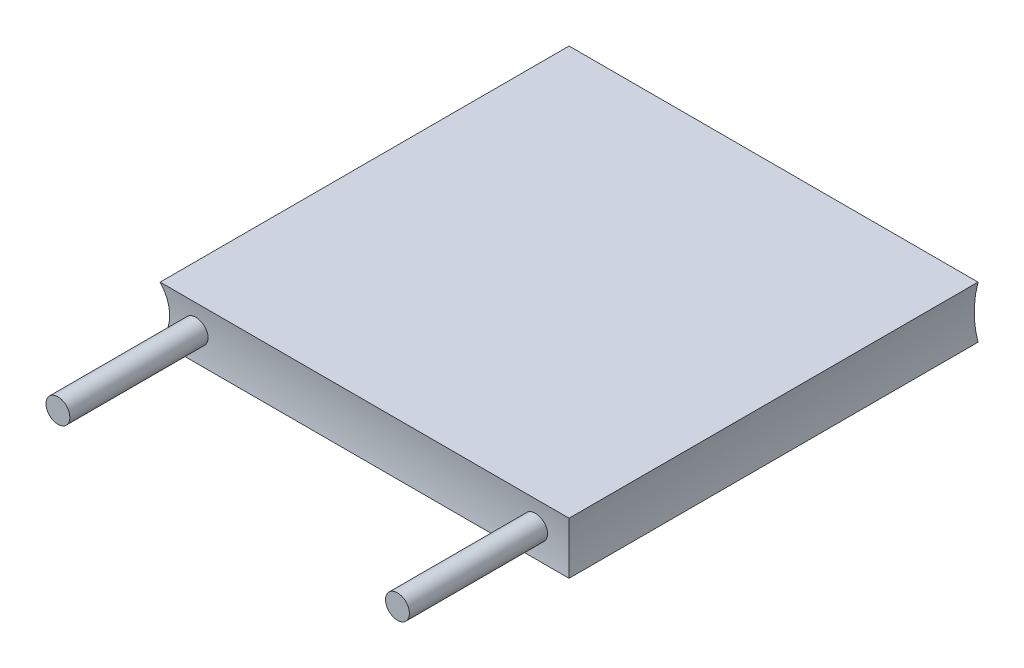
ISO-10303-21;
HEADER;
FILE_DESCRIPTION(('STEP AP214'),'2;1');
FILE_NAME('part.step','',(''),(''),'','','');
FILE_SCHEMA(('AUTOMOTIVE_DESIGN { 1 0 10303 214 1 1 1 1 }'));
ENDSEC;
DATA;
#1=APPLICATION_CONTEXT('core data for automotive mechanical design processes');
#2=APPLICATION_PROTOCOL_DEFINITION('international standard','automotive_design',2000,#1);
#3=PRODUCT_CONTEXT('',#1,'mechanical');
#4=PRODUCT('Part','Part','',(#3));
#5=PRODUCT_RELATED_PRODUCT_CATEGORY('part','',(#4));
#6=PRODUCT_DEFINITION_FORMATION('','',#4);
#7=PRODUCT_DEFINITION_CONTEXT('part definition',#1,'design');
#8=PRODUCT_DEFINITION('design','',#6,#7);
#9=PRODUCT_DEFINITION_SHAPE('','',#8);
#10=(LENGTH_UNIT() NAMED_UNIT(*) SI_UNIT(.MILLI.,.METRE.));
#11=(NAMED_UNIT(*) PLANE_ANGLE_UNIT() SI_UNIT($,.RADIAN.));
#12=(NAMED_UNIT(*) SI_UNIT($,.STERADIAN.) SOLID_ANGLE_UNIT());
#13=UNCERTAINTY_MEASURE_WITH_UNIT(LENGTH_MEASURE(1.E-05),#10,'distance_accuracy_value','');
#14=(GEOMETRIC_REPRESENTATION_CONTEXT(3) GLOBAL_UNCERTAINTY_ASSIGNED_CONTEXT((#13)) GLOBAL_UNIT_ASSIGNED_CONTEXT((#10,
#11,#12)) REPRESENTATION_CONTEXT('',''));
#15=CARTESIAN_POINT('',(0.,0.,0.));
#16=DIRECTION('',(0.,0.,1.));
#17=DIRECTION('',(1.,0.,0.));
#18=AXIS2_PLACEMENT_3D('',#15,#16,#17);
#19=CARTESIAN_POINT('',(43.,1.91,-30.));
#20=DIRECTION('',(0.,0.,1.));
#21=DIRECTION('',(1.,0.,0.));
#22=AXIS2_PLACEMENT_3D('',#19,#20,#21);
#23=CYLINDRICAL_SURFACE('',#22,13.1395623975839);
#24=CARTESIAN_POINT('',(43.,1.91,-43.));
#25=DIRECTION('',(0.707106781186547,0.,0.707106781186548));
#26=DIRECTION('',(-0.707106781186547,0.,0.707106781186548));
#27=AXIS2_PLACEMENT_3D('',#24,#25,#26);
#28=ELLIPSE('',#27,18.5821473463107,13.1395623975839);
#29=CARTESIAN_POINT('',(30.,3.82,-30.));
#30=VERTEX_POINT('',#29);
#31=CARTESIAN_POINT('',(30.,0.,-30.));
#32=VERTEX_POINT('',#31);
#33=EDGE_CURVE('E101',#30,#32,#28,.T.);
#34=ORIENTED_EDGE('',*,*,#33,.F.);
#35=DIRECTION('',(0.,0.,-1.));
#36=VECTOR('',#35,1.);
#37=CARTESIAN_POINT('',(30.,3.82,0.));
#38=LINE('',#37,#36);
#39=CARTESIAN_POINT('',(30.,3.82,0.));
#40=VERTEX_POINT('',#39);
#41=EDGE_CURVE('E92',#40,#30,#38,.T.);
#42=ORIENTED_EDGE('',*,*,#41,.F.);
#43=CARTESIAN_POINT('',(43.,1.91,13.));
#44=DIRECTION('',(-0.707106781186547,0.,0.707106781186548));
#45=DIRECTION('',(0.707106781186547,0.,0.707106781186548));
#46=AXIS2_PLACEMENT_3D('',#43,#44,#45);
#47=ELLIPSE('',#46,18.5821473463106,13.1395623975839);
#48=CARTESIAN_POINT('',(30.,0.,0.));
#49=VERTEX_POINT('',#48);
#50=EDGE_CURVE('E131',#40,#49,#47,.T.);
#51=ORIENTED_EDGE('',*,*,#50,.T.);
#52=DIRECTION('',(0.,0.,-1.));
#53=VECTOR('',#52,1.);
#54=CARTESIAN_POINT('',(30.,0.,0.));
#55=LINE('',#54,#53);
#56=EDGE_CURVE('E103',#49,#32,#55,.T.);
#57=ORIENTED_EDGE('',*,*,#56,.T.);
#58=EDGE_LOOP('',(#34,#42,#51,#57));
#59=FACE_BOUND('',#58,.T.);
#60=ADVANCED_FACE('F32',(#59),#23,.F.);
#61=CARTESIAN_POINT('',(-3.,1.91,-30.));
#62=DIRECTION('',(0.,0.,1.));
#63=DIRECTION('',(1.,0.,0.));
#64=AXIS2_PLACEMENT_3D('',#61,#62,#63);
#65=CYLINDRICAL_SURFACE('',#64,3.55641673598582);
#66=DIRECTION('',(0.,0.,1.));
#67=VECTOR('',#66,1.);
#68=CARTESIAN_POINT('',(0.,3.82,0.));
#69=LINE('',#68,#67);
#70=CARTESIAN_POINT('',(0.,3.82,-30.));
#71=VERTEX_POINT('',#70);
#72=CARTESIAN_POINT('',(0.,3.82,0.));
#73=VERTEX_POINT('',#72);
#74=EDGE_CURVE('E85',#71,#73,#69,.T.);
#75=ORIENTED_EDGE('',*,*,#74,.F.);
#76=CARTESIAN_POINT('',(0.,3.82,-30.));
#77=CARTESIAN_POINT('',(0.0524340141665732,3.7376576027691,-29.9878959296317));
#78=CARTESIAN_POINT('',(0.101497308266513,3.65309589850319,-29.9762770147328));
#79=CARTESIAN_POINT('',(0.192565787085412,3.48008531427569,-29.9542920316486));
#80=CARTESIAN_POINT('',(0.234570111388854,3.39163596210516,-29.9439261162342));
#81=CARTESIAN_POINT('',(0.311192698175684,3.21141797930009,-29.9247323422504));
#82=CARTESIAN_POINT('',(0.34581064305102,3.11964920613159,-29.9159045498219));
#83=CARTESIAN_POINT('',(0.407382960768319,2.93345987035824,-29.900023500811));
#84=CARTESIAN_POINT('',(0.434337815801482,2.83903947501468,-29.8929701325782));
#85=CARTESIAN_POINT('',(0.503402555288943,2.55249978066082,-29.8747663273823));
#86=CARTESIAN_POINT('',(0.533681682249221,2.35717473757787,-29.8665801791533));
#87=CARTESIAN_POINT('',(0.561457987623733,1.96421636047236,-29.859078593547));
#88=CARTESIAN_POINT('',(0.558970390129337,1.76658414105347,-29.8597590365681));
#89=CARTESIAN_POINT('',(0.521725621723675,1.37802347432962,-29.8697964380615));
#90=CARTESIAN_POINT('',(0.487517113333934,1.18703817837664,-29.8790058709809));
#91=CARTESIAN_POINT('',(0.38871370456758,0.813662563870923,-29.9049198565123));
#92=CARTESIAN_POINT('',(0.324135148656792,0.631267680171523,-29.9216203773687));
#93=CARTESIAN_POINT('',(0.2100829254487,0.376703919434626,-29.9499623690591));
#94=CARTESIAN_POINT('',(0.171828525401818,0.299072168959661,-29.9593363274005));
#95=CARTESIAN_POINT('',(0.0899185885653121,0.147069033577241,-29.9790160477099));
#96=CARTESIAN_POINT('',(0.0462757461150745,0.072690524409943,-29.9893196048162));
#97=CARTESIAN_POINT('',(0.,0.,-30.));
#98=B_SPLINE_CURVE_WITH_KNOTS('',3,(#76,#77,#78,#79,#80,#81,#82,#83,#84,#85,#86,#87,#88,#89,#90,
#91,#92,#93,#94,#95,#96,#97),.UNSPECIFIED.,.F.,.F.,(4,2,2,2,2,2,2,2,2,2,4),(0.,
0.295019032244304,0.59007399822107,0.885141648755497,1.18019072838255,1.7705242492091,
2.36058349866819,2.94062339726882,3.52035148825475,3.78131265540512,4.04167036673184),.UNSPECIFIED.);
#99=CARTESIAN_POINT('',(0.,0.,-30.));
#100=VERTEX_POINT('',#99);
#101=EDGE_CURVE('E11',#71,#100,#98,.T.);
#102=ORIENTED_EDGE('',*,*,#101,.T.);
#103=DIRECTION('',(0.,0.,1.));
#104=VECTOR('',#103,1.);
#105=CARTESIAN_POINT('',(0.,0.,0.));
#106=LINE('',#105,#104);
#107=CARTESIAN_POINT('',(0.,0.,0.));
#108=VERTEX_POINT('',#107);
#109=EDGE_CURVE('E98',#100,#108,#106,.T.);
#110=ORIENTED_EDGE('',*,*,#109,.T.);
#111=CARTESIAN_POINT('',(0.,3.82,0.));
#112=CARTESIAN_POINT('',(0.0524340141665755,3.7376576027691,-0.012104070368281));
#113=CARTESIAN_POINT('',(0.101497308266515,3.65309589850318,-0.0237229852672433));
#114=CARTESIAN_POINT('',(0.192565787085414,3.48008531427568,-0.0457079683514324));
#115=CARTESIAN_POINT('',(0.234570111388855,3.39163596210516,-0.0560738837657963));
#116=CARTESIAN_POINT('',(0.311192698175684,3.21141797930008,-0.07526765774962));
#117=CARTESIAN_POINT('',(0.345810643051021,3.11964920613159,-0.0840954501781037));
#118=CARTESIAN_POINT('',(0.40738296076832,2.93345987035824,-0.0999764991889885));
#119=CARTESIAN_POINT('',(0.434337815801483,2.83903947501468,-0.107029867421795));
#120=CARTESIAN_POINT('',(0.503402555288944,2.55249978066081,-0.125233672617654));
#121=CARTESIAN_POINT('',(0.533681682249222,2.35717473757786,-0.133419820846655));
#122=CARTESIAN_POINT('',(0.561457987623734,1.96421636047235,-0.140921406453019));
#123=CARTESIAN_POINT('',(0.558970390129337,1.76658414105347,-0.140240963431877));
#124=CARTESIAN_POINT('',(0.521725621723675,1.37802347432962,-0.130203561938456));
#125=CARTESIAN_POINT('',(0.487517113333933,1.18703817837664,-0.120994129019062));
#126=CARTESIAN_POINT('',(0.388713704567579,0.813662563870919,-0.0950801434877438));
#127=CARTESIAN_POINT('',(0.32413514865679,0.63126768017152,-0.0783796226313037));
#128=CARTESIAN_POINT('',(0.210082925448698,0.376703919434623,-0.0500376309409025));
#129=CARTESIAN_POINT('',(0.171828525401817,0.299072168959659,-0.0406636725994515));
#130=CARTESIAN_POINT('',(0.0899185885653115,0.14706903357724,-0.0209839522901296));
#131=CARTESIAN_POINT('',(0.0462757461150744,0.0726905244099426,-0.010680395183792));
#132=CARTESIAN_POINT('',(0.,0.,0.));
#133=B_SPLINE_CURVE_WITH_KNOTS('',3,(#111,#112,#113,#114,#115,#116,#117,#118,#119,#120,#121,
#122,#123,#124,#125,#126,#127,#128,#129,#130,#131,#132),.UNSPECIFIED.,.F.,.F.,(4,2,2,2,2,2,2,2,
2,2,4),(0.,0.295019032244303,0.590073998221069,0.885141648755496,1.18019072838255,
1.7705242492091,2.36058349866819,2.94062339726882,3.52035148825475,3.78131265540511,
4.04167036673183),.UNSPECIFIED.);
#134=EDGE_CURVE('E46',#73,#108,#133,.T.);
#135=ORIENTED_EDGE('',*,*,#134,.F.);
#136=EDGE_LOOP('',(#75,#102,#110,#135));
#137=FACE_BOUND('',#136,.T.);
#138=ADVANCED_FACE('F86',(#137),#65,.F.);
#139=CARTESIAN_POINT('',(0.,3.82,0.));
#140=DIRECTION('',(0.,-1.,0.));
#141=DIRECTION('',(0.,0.,-1.));
#142=AXIS2_PLACEMENT_3D('',#139,#140,#141);
#143=PLANE('',#142);
#144=ORIENTED_EDGE('',*,*,#74,.T.);
#145=DIRECTION('',(1.,0.,0.));
#146=VECTOR('',#145,1.);
#147=CARTESIAN_POINT('',(0.,3.82,0.));
#148=LINE('',#147,#146);
#149=EDGE_CURVE('E61',#73,#40,#148,.T.);
#150=ORIENTED_EDGE('',*,*,#149,.T.);
#151=ORIENTED_EDGE('',*,*,#41,.T.);
#152=DIRECTION('',(-1.,0.,0.));
#153=VECTOR('',#152,1.);
#154=CARTESIAN_POINT('',(0.,3.82,-30.));
#155=LINE('',#154,#153);
#156=EDGE_CURVE('E79',#30,#71,#155,.T.);
#157=ORIENTED_EDGE('',*,*,#156,.T.);
#158=EDGE_LOOP('',(#144,#150,#151,#157));
#159=FACE_BOUND('',#158,.T.);
#160=ADVANCED_FACE('F90',(#159),#143,.F.);
#161=CARTESIAN_POINT('',(0.,0.,0.));
#162=DIRECTION('',(0.,-1.,0.));
#163=DIRECTION('',(0.,0.,-1.));
#164=AXIS2_PLACEMENT_3D('',#161,#162,#163);
#165=PLANE('',#164);
#166=ORIENTED_EDGE('',*,*,#109,.F.);
#167=DIRECTION('',(-1.,0.,0.));
#168=VECTOR('',#167,1.);
#169=CARTESIAN_POINT('',(0.,0.,-30.));
#170=LINE('',#169,#168);
#171=EDGE_CURVE('E54',#32,#100,#170,.T.);
#172=ORIENTED_EDGE('',*,*,#171,.F.);
#173=ORIENTED_EDGE('',*,*,#56,.F.);
#174=DIRECTION('',(1.,0.,0.));
#175=VECTOR('',#174,1.);
#176=CARTESIAN_POINT('',(0.,0.,0.));
#177=LINE('',#176,#175);
#178=EDGE_CURVE('E100',#108,#49,#177,.T.);
#179=ORIENTED_EDGE('',*,*,#178,.F.);
#180=EDGE_LOOP('',(#166,#172,#173,#179));
#181=FACE_BOUND('',#180,.T.);
#182=ADVANCED_FACE('F34',(#181),#165,.T.);
#183=CARTESIAN_POINT('',(45.,1.91,13.));
#184=DIRECTION('',(-1.,0.,0.));
#185=DIRECTION('',(0.,0.,1.));
#186=AXIS2_PLACEMENT_3D('',#183,#184,#185);
#187=CYLINDRICAL_SURFACE('',#186,13.1395623975838);
#188=CARTESIAN_POINT('',(28.2856665159736,1.91,-0.13956239758387));
#189=CARTESIAN_POINT('',(28.2856643585644,1.86090922868925,-0.139562011231252));
#190=CARTESIAN_POINT('',(28.2815213674995,1.81178425006474,-0.139284344695328));
#191=CARTESIAN_POINT('',(28.2650538879974,1.71489122104358,-0.138203372676909));
#192=CARTESIAN_POINT('',(28.2527199210849,1.6671248096187,-0.137399458243601));
#193=CARTESIAN_POINT('',(28.2202267431594,1.57436640791405,-0.1353569176843));
#194=CARTESIAN_POINT('',(28.2000717123431,1.52937295040941,-0.134118523812416));
#195=CARTESIAN_POINT('',(28.1525154376539,1.44341938562474,-0.131346238360727));
#196=CARTESIAN_POINT('',(28.1251158341772,1.40245836815288,-0.129812413696948));
#197=CARTESIAN_POINT('',(28.0637979033463,1.32565197687493,-0.126618741211458));
#198=CARTESIAN_POINT('',(28.0298699618723,1.28981428543958,-0.124958709736525));
#199=CARTESIAN_POINT('',(27.9564783880142,1.2243375959128,-0.121701281471802));
#200=CARTESIAN_POINT('',(27.9170145224303,1.1946988590824,-0.120103887324228));
#201=CARTESIAN_POINT('',(27.8336270941972,1.14243716995884,-0.117150436424197));
#202=CARTESIAN_POINT('',(27.7896994668654,1.11982068947904,-0.115794602784876));
#203=CARTESIAN_POINT('',(27.6986599217259,1.08228690385613,-0.113479580144612));
#204=CARTESIAN_POINT('',(27.6515480419754,1.06736950671439,-0.112520386404128));
#205=CARTESIAN_POINT('',(27.5555520871962,1.04567889697692,-0.111108581462636));
#206=CARTESIAN_POINT('',(27.5066707702489,1.03889352796965,-0.110655214181674));
#207=CARTESIAN_POINT('',(27.4084610315657,1.03362205413911,-0.110303925663096));
#208=CARTESIAN_POINT('',(27.359132615479,1.03513584459974,-0.110405997417129));
#209=CARTESIAN_POINT('',(27.2615118460389,1.04640963954711,-0.111153374572183));
#210=CARTESIAN_POINT('',(27.213217964821,1.0561564796105,-0.111797812738008));
#211=CARTESIAN_POINT('',(27.118953268784,1.08359927176277,-0.113555936418823));
#212=CARTESIAN_POINT('',(27.0729824694206,1.10129527673063,-0.114669625055331));
#213=CARTESIAN_POINT('',(26.9846266443685,1.14414898325375,-0.117241746748748));
#214=CARTESIAN_POINT('',(26.942244517869,1.16931264517466,-0.118700454996112));
#215=CARTESIAN_POINT('',(26.8623008083921,1.22638304690261,-0.121797963300711));
#216=CARTESIAN_POINT('',(26.8247392871868,1.25828987310381,-0.123436765665201));
#217=CARTESIAN_POINT('',(26.7554264377825,1.32801497610843,-0.126713639011839));
#218=CARTESIAN_POINT('',(26.7236865666891,1.36584464376005,-0.128351702354884));
#219=CARTESIAN_POINT('',(26.6670064062316,1.4463016855573,-0.131439442657029));
#220=CARTESIAN_POINT('',(26.6420661195564,1.48892906160007,-0.132889119541634));
#221=CARTESIAN_POINT('',(26.5996940162001,1.57777852132476,-0.135436874592644));
#222=CARTESIAN_POINT('',(26.5822626462441,1.62400081868489,-0.136534931839279));
#223=CARTESIAN_POINT('',(26.5554109062885,1.71872488137971,-0.138255443022908));
#224=CARTESIAN_POINT('',(26.5459904301021,1.76722661649078,-0.138877903264075));
#225=CARTESIAN_POINT('',(26.5354421162315,1.86503337989685,-0.139576269345161));
#226=CARTESIAN_POINT('',(26.534298440704,1.91433669297839,-0.139653219025976));
#227=CARTESIAN_POINT('',(26.5402947923253,2.01243444018222,-0.139254671621502));
#228=CARTESIAN_POINT('',(26.5474347704467,2.06122887731462,-0.138779177805894));
#229=CARTESIAN_POINT('',(26.5697826355352,2.15687906685138,-0.137329934164601));
#230=CARTESIAN_POINT('',(26.584983243081,2.20373652741603,-0.136356633927777));
#231=CARTESIAN_POINT('',(26.623013477166,2.29423540810253,-0.134021247922862));
#232=CARTESIAN_POINT('',(26.6458431814993,2.33787679542448,-0.132659158190298));
#233=CARTESIAN_POINT('',(26.6985237851387,2.42077715968067,-0.129696577050649));
#234=CARTESIAN_POINT('',(26.7283852473351,2.46002941126629,-0.128095728326673));
#235=CARTESIAN_POINT('',(26.7942663548604,2.532969541853,-0.124836935617119));
#236=CARTESIAN_POINT('',(26.8302860688146,2.56665735883792,-0.123178990995452));
#237=CARTESIAN_POINT('',(26.9075296124453,2.62756611520377,-0.119989831664507));
#238=CARTESIAN_POINT('',(26.9487615620632,2.65477676914425,-0.118458820999653));
#239=CARTESIAN_POINT('',(27.0352184123286,2.7018884048618,-0.115699449197823));
#240=CARTESIAN_POINT('',(27.0804432856587,2.72178943664229,-0.114471085990524));
#241=CARTESIAN_POINT('',(27.1735648471413,2.75369914999014,-0.112457013516544));
#242=CARTESIAN_POINT('',(27.2214593194708,2.76571427423339,-0.111670942978083));
#243=CARTESIAN_POINT('',(27.3185912334587,2.78153213754436,-0.110629105588364));
#244=CARTESIAN_POINT('',(27.3678286596281,2.78533497128831,-0.110373332623519));
#245=CARTESIAN_POINT('',(27.4661465557826,2.78461936645529,-0.110421083568697));
#246=CARTESIAN_POINT('',(27.5152271447912,2.78011709590752,-0.110723520779187));
#247=CARTESIAN_POINT('',(27.6119337534358,2.76295264040811,-0.111851308691024));
#248=CARTESIAN_POINT('',(27.6595597704968,2.75029044101225,-0.112676660318003));
#249=CARTESIAN_POINT('',(27.7520074782674,2.71716929121108,-0.114757000464673));
#250=CARTESIAN_POINT('',(27.7968292086758,2.69671045120775,-0.116011982900682));
#251=CARTESIAN_POINT('',(27.8824038349883,2.64857888852322,-0.118810151700708));
#252=CARTESIAN_POINT('',(27.9231568289826,2.62090633980997,-0.120353331114225));
#253=CARTESIAN_POINT('',(27.9995193609765,2.55907279853523,-0.12355751953105));
#254=CARTESIAN_POINT('',(28.0351193619501,2.5249000392475,-0.125218738740693));
#255=CARTESIAN_POINT('',(28.1000902290545,2.45105341462624,-0.128469985152853));
#256=CARTESIAN_POINT('',(28.1294595720447,2.41137820808088,-0.130059994872797));
#257=CARTESIAN_POINT('',(28.1811600828675,2.32760240202661,-0.132991515532781));
#258=CARTESIAN_POINT('',(28.2034817405894,2.2834959278202,-0.134332689698195));
#259=CARTESIAN_POINT('',(28.2403751976539,2.19218401156649,-0.136611028367243));
#260=CARTESIAN_POINT('',(28.2549560442571,2.1449822600496,-0.137548664272136));
#261=CARTESIAN_POINT('',(28.2721775124933,2.06624456381904,-0.138669433308048));
#262=CARTESIAN_POINT('',(28.2772293164366,2.03521715382826,-0.139002800447328));
#263=CARTESIAN_POINT('',(28.2839745056085,1.97279782899003,-0.139449405995041));
#264=CARTESIAN_POINT('',(28.2856678961803,1.94140591472258,-0.139562644753695));
#265=CARTESIAN_POINT('',(28.2856665159736,1.91,-0.13956239758387));
#266=B_SPLINE_CURVE_WITH_KNOTS('',3,(#188,#189,#190,#191,#192,#193,#194,#195,#196,#197,#198,
#199,#200,#201,#202,#203,#204,#205,#206,#207,#208,#209,#210,#211,#212,#213,#214,#215,#216,#217,
#218,#219,#220,#221,#222,#223,#224,#225,#226,#227,#228,#229,#230,#231,#232,#233,#234,#235,#236,
#237,#238,#239,#240,#241,#242,#243,#244,#245,#246,#247,#248,#249,#250,#251,#252,#253,#254,#255,
#256,#257,#258,#259,#260,#261,#262,#263,#264,#265),.UNSPECIFIED.,.T.,.F.,(4,2,2,2,2,2,2,2,2,2,2,
2,2,2,2,2,2,2,2,2,2,2,2,2,2,2,2,2,2,2,2,2,2,2,2,2,2,2,4),(0.,0.147157661025031,0.29448590812443,
0.441735519544378,0.588951817591815,0.736386600054847,0.883827595050107,1.03140407321466,
1.17897878790324,1.32633261973306,1.47368459230393,1.62080139809449,1.76791918254134,
1.9151547074054,2.06239211878158,2.20991625753702,2.35744045462749,2.50497342710632,
2.6525044439602,2.79975308208555,2.94700084871216,3.09411586420951,3.24123237988684,
3.38857131532298,3.53591189275533,3.68348490238464,3.83105690248264,3.97850818775215,
4.12595777310574,4.27312061267051,4.42028371273491,4.567444729018,4.71460219665041,
4.86202862945173,5.00949106055114,5.15715163458887,5.30463924467709,5.39878378921106,
5.49292818396237),.UNSPECIFIED.);
#267=CARTESIAN_POINT('',(28.2856665159736,1.91,-0.13956239758387));
#268=VERTEX_POINT('',#267);
#269=EDGE_CURVE('E36',#268,#268,#266,.T.);
#270=ORIENTED_EDGE('',*,*,#269,.T.);
#271=EDGE_LOOP('',(#270));
#272=FACE_BOUND('',#271,.T.);
#273=CARTESIAN_POINT('',(3.375,1.91,-0.13956239758387));
#274=CARTESIAN_POINT('',(3.3749978425908,1.86090922868925,-0.139562011231252));
#275=CARTESIAN_POINT('',(3.37085485152586,1.81178425006473,-0.139284344695328));
#276=CARTESIAN_POINT('',(3.35438737202379,1.71489122104358,-0.138203372676909));
#277=CARTESIAN_POINT('',(3.34205340511129,1.6671248096187,-0.137399458243601));
#278=CARTESIAN_POINT('',(3.30956022718576,1.57436640791405,-0.1353569176843));
#279=CARTESIAN_POINT('',(3.28940519636949,1.5293729504094,-0.134118523812416));
#280=CARTESIAN_POINT('',(3.24184892168029,1.44341938562474,-0.131346238360727));
#281=CARTESIAN_POINT('',(3.21444931820352,1.40245836815288,-0.129812413696948));
#282=CARTESIAN_POINT('',(3.15313138737268,1.32565197687492,-0.126618741211458));
#283=CARTESIAN_POINT('',(3.11920344589862,1.28981428543958,-0.124958709736525));
#284=CARTESIAN_POINT('',(3.04581187204058,1.2243375959128,-0.121701281471802));
#285=CARTESIAN_POINT('',(3.00634800645671,1.1946988590824,-0.120103887324228));
#286=CARTESIAN_POINT('',(2.92296057822355,1.14243716995884,-0.117150436424197));
#287=CARTESIAN_POINT('',(2.87903295089177,1.11982068947904,-0.115794602784877));
#288=CARTESIAN_POINT('',(2.78799340575228,1.08228690385613,-0.113479580144613));
#289=CARTESIAN_POINT('',(2.74088152600176,1.06736950671438,-0.11252038640413));
#290=CARTESIAN_POINT('',(2.64488557122253,1.04567889697692,-0.111108581462637));
#291=CARTESIAN_POINT('',(2.59600425427523,1.03889352796964,-0.110655214181675));
#292=CARTESIAN_POINT('',(2.49779451559205,1.03362205413911,-0.110303925663096));
#293=CARTESIAN_POINT('',(2.44846609950536,1.03513584459974,-0.110405997417128));
#294=CARTESIAN_POINT('',(2.35084533006525,1.04640963954711,-0.111153374572182));
#295=CARTESIAN_POINT('',(2.30255144884739,1.0561564796105,-0.111797812738008));
#296=CARTESIAN_POINT('',(2.20828675281039,1.08359927176277,-0.113555936418824));
#297=CARTESIAN_POINT('',(2.16231595344698,1.10129527673063,-0.114669625055332));
#298=CARTESIAN_POINT('',(2.0739601283949,1.14414898325375,-0.11724174674875));
#299=CARTESIAN_POINT('',(2.03157800189538,1.16931264517466,-0.118700454996113));
#300=CARTESIAN_POINT('',(1.95163429241849,1.22638304690261,-0.12179796330071));
#301=CARTESIAN_POINT('',(1.91407277121316,1.25828987310381,-0.123436765665201));
#302=CARTESIAN_POINT('',(1.84475992180891,1.32801497610843,-0.126713639011838));
#303=CARTESIAN_POINT('',(1.81302005071543,1.36584464376005,-0.128351702354885));
#304=CARTESIAN_POINT('',(1.756339890258,1.4463016855573,-0.131439442657029));
#305=CARTESIAN_POINT('',(1.73139960358279,1.48892906160006,-0.132889119541634));
#306=CARTESIAN_POINT('',(1.68902750022645,1.57777852132476,-0.135436874592643));
#307=CARTESIAN_POINT('',(1.67159613027041,1.62400081868489,-0.136534931839278));
#308=CARTESIAN_POINT('',(1.64474439031485,1.71872488137971,-0.138255443022909));
#309=CARTESIAN_POINT('',(1.6353239141285,1.76722661649078,-0.138877903264076));
#310=CARTESIAN_POINT('',(1.6247756002579,1.86503337989685,-0.139576269345162));
#311=CARTESIAN_POINT('',(1.62363192473036,1.91433669297839,-0.139653219025977));
#312=CARTESIAN_POINT('',(1.6296282763517,2.01243444018222,-0.139254671621503));
#313=CARTESIAN_POINT('',(1.63676825447309,2.06122887731462,-0.138779177805896));
#314=CARTESIAN_POINT('',(1.6591161195616,2.15687906685138,-0.137329934164601));
#315=CARTESIAN_POINT('',(1.67431672710738,2.20373652741603,-0.136356633927776));
#316=CARTESIAN_POINT('',(1.71234696119238,2.29423540810253,-0.134021247922861));
#317=CARTESIAN_POINT('',(1.73517666552562,2.33787679542448,-0.132659158190299));
#318=CARTESIAN_POINT('',(1.78785726916506,2.42077715968067,-0.12969657705065));
#319=CARTESIAN_POINT('',(1.81771873136143,2.46002941126629,-0.128095728326674));
#320=CARTESIAN_POINT('',(1.88359983888678,2.532969541853,-0.124836935617121));
#321=CARTESIAN_POINT('',(1.91961955284099,2.56665735883792,-0.123178990995454));
#322=CARTESIAN_POINT('',(1.99686309647167,2.62756611520376,-0.119989831664508));
#323=CARTESIAN_POINT('',(2.03809504608957,2.65477676914425,-0.118458820999653));
#324=CARTESIAN_POINT('',(2.12455189635491,2.7018884048618,-0.115699449197822));
#325=CARTESIAN_POINT('',(2.16977676968507,2.72178943664229,-0.114471085990525));
#326=CARTESIAN_POINT('',(2.26289833116764,2.75369914999014,-0.112457013516545));
#327=CARTESIAN_POINT('',(2.31079280349713,2.76571427423339,-0.111670942978082));
#328=CARTESIAN_POINT('',(2.40792471748505,2.78153213754437,-0.110629105588362));
#329=CARTESIAN_POINT('',(2.45716214365448,2.78533497128831,-0.110373332623519));
#330=CARTESIAN_POINT('',(2.55548003980894,2.78461936645529,-0.110421083568697));
#331=CARTESIAN_POINT('',(2.60456062881757,2.78011709590752,-0.110723520779186));
#332=CARTESIAN_POINT('',(2.70126723746218,2.76295264040811,-0.111851308691022));
#333=CARTESIAN_POINT('',(2.74889325452321,2.75029044101225,-0.112676660318));
#334=CARTESIAN_POINT('',(2.84134096229379,2.71716929121108,-0.114757000464672));
#335=CARTESIAN_POINT('',(2.88616269270215,2.69671045120775,-0.116011982900681));
#336=CARTESIAN_POINT('',(2.9717373190147,2.64857888852322,-0.118810151700708));
#337=CARTESIAN_POINT('',(3.01249031300899,2.62090633980997,-0.120353331114227));
#338=CARTESIAN_POINT('',(3.08885284500283,2.55907279853523,-0.123557519531052));
#339=CARTESIAN_POINT('',(3.12445284597645,2.5249000392475,-0.125218738740695));
#340=CARTESIAN_POINT('',(3.18942371308085,2.45105341462624,-0.128469985152854));
#341=CARTESIAN_POINT('',(3.21879305607108,2.41137820808088,-0.130059994872797));
#342=CARTESIAN_POINT('',(3.27049356689387,2.32760240202661,-0.13299151553278));
#343=CARTESIAN_POINT('',(3.29281522461573,2.2834959278202,-0.134332689698194));
#344=CARTESIAN_POINT('',(3.32970868168029,2.19218401156649,-0.136611028367244));
#345=CARTESIAN_POINT('',(3.34428952828344,2.1449822600496,-0.137548664272137));
#346=CARTESIAN_POINT('',(3.36151099651966,2.06624456381904,-0.138669433308047));
#347=CARTESIAN_POINT('',(3.36656280046299,2.03521715382826,-0.139002800447326));
#348=CARTESIAN_POINT('',(3.3733079896349,1.97279782899003,-0.13944940599504));
#349=CARTESIAN_POINT('',(3.37500138020666,1.94140591472258,-0.139562644753695));
#350=CARTESIAN_POINT('',(3.375,1.91,-0.13956239758387));
#351=B_SPLINE_CURVE_WITH_KNOTS('',3,(#273,#274,#275,#276,#277,#278,#279,#280,#281,#282,#283,
#284,#285,#286,#287,#288,#289,#290,#291,#292,#293,#294,#295,#296,#297,#298,#299,#300,#301,#302,
#303,#304,#305,#306,#307,#308,#309,#310,#311,#312,#313,#314,#315,#316,#317,#318,#319,#320,#321,
#322,#323,#324,#325,#326,#327,#328,#329,#330,#331,#332,#333,#334,#335,#336,#337,#338,#339,#340,
#341,#342,#343,#344,#345,#346,#347,#348,#349,#350),.UNSPECIFIED.,.T.,.F.,(4,2,2,2,2,2,2,2,2,2,2,
2,2,2,2,2,2,2,2,2,2,2,2,2,2,2,2,2,2,2,2,2,2,2,2,2,2,2,4),(0.,0.147157661025031,
0.294485908124431,0.441735519544379,0.588951817591815,0.736386600054847,0.883827595050107,
1.03140407321467,1.17897878790324,1.32633261973306,1.47368459230393,1.62080139809449,
1.76791918254135,1.91515470740541,2.06239211878158,2.20991625753702,2.35744045462749,
2.50497342710633,2.65250444396021,2.79975308208556,2.94700084871216,3.09411586420952,
3.24123237988684,3.38857131532299,3.53591189275534,3.68348490238464,3.83105690248265,
3.97850818775216,4.12595777310575,4.27312061267051,4.42028371273492,4.56744472901801,
4.71460219665042,4.86202862945174,5.00949106055115,5.15715163458888,5.3046392446771,
5.39878378921107,5.49292818396238),.UNSPECIFIED.);
#352=CARTESIAN_POINT('',(3.375,1.91,-0.13956239758387));
#353=VERTEX_POINT('',#352);
#354=EDGE_CURVE('E126',#353,#353,#351,.T.);
#355=ORIENTED_EDGE('',*,*,#354,.T.);
#356=EDGE_LOOP('',(#355));
#357=FACE_BOUND('',#356,.T.);
#358=ORIENTED_EDGE('',*,*,#149,.F.);
#359=ORIENTED_EDGE('',*,*,#134,.T.);
#360=ORIENTED_EDGE('',*,*,#178,.T.);
#361=ORIENTED_EDGE('',*,*,#50,.F.);
#362=EDGE_LOOP('',(#358,#359,#360,#361));
#363=FACE_BOUND('',#362,.T.);
#364=ADVANCED_FACE('F118',(#272,#357,#363),#187,.F.);
#365=CARTESIAN_POINT('',(45.,1.91,-43.));
#366=DIRECTION('',(-1.,0.,0.));
#367=DIRECTION('',(0.,0.,1.));
#368=AXIS2_PLACEMENT_3D('',#365,#366,#367);
#369=CYLINDRICAL_SURFACE('',#368,13.1395623975839);
#370=ORIENTED_EDGE('',*,*,#33,.T.);
#371=ORIENTED_EDGE('',*,*,#171,.T.);
#372=ORIENTED_EDGE('',*,*,#101,.F.);
#373=ORIENTED_EDGE('',*,*,#156,.F.);
#374=EDGE_LOOP('',(#370,#371,#372,#373));
#375=FACE_BOUND('',#374,.T.);
#376=ADVANCED_FACE('F77',(#375),#369,.F.);
#377=CARTESIAN_POINT('',(2.5,1.91,-5.));
#378=DIRECTION('',(0.,0.,1.));
#379=DIRECTION('',(1.,0.,0.));
#380=AXIS2_PLACEMENT_3D('',#377,#378,#379);
#381=CYLINDRICAL_SURFACE('',#380,0.875);
#382=CARTESIAN_POINT('',(2.5,1.91,10.));
#383=DIRECTION('',(0.,0.,1.));
#384=DIRECTION('',(1.,0.,0.));
#385=AXIS2_PLACEMENT_3D('',#382,#383,#384);
#386=CIRCLE('',#385,0.875);
#387=CARTESIAN_POINT('',(3.375,1.91,10.));
#388=VERTEX_POINT('',#387);
#389=EDGE_CURVE('E132',#388,#388,#386,.T.);
#390=ORIENTED_EDGE('',*,*,#389,.F.);
#391=EDGE_LOOP('',(#390));
#392=FACE_BOUND('',#391,.T.);
#393=ORIENTED_EDGE('',*,*,#354,.F.);
#394=EDGE_LOOP('',(#393));
#395=FACE_BOUND('',#394,.T.);
#396=ADVANCED_FACE('F133',(#392,#395),#381,.T.);
#397=CARTESIAN_POINT('',(2.5,1.91,10.));
#398=DIRECTION('',(0.,0.,1.));
#399=DIRECTION('',(1.,0.,0.));
#400=AXIS2_PLACEMENT_3D('',#397,#398,#399);
#401=PLANE('',#400);
#402=ORIENTED_EDGE('',*,*,#389,.T.);
#403=EDGE_LOOP('',(#402));
#404=FACE_BOUND('',#403,.T.);
#405=ADVANCED_FACE('F137',(#404),#401,.T.);
#406=CARTESIAN_POINT('',(27.4106665159736,1.91,-5.));
#407=DIRECTION('',(0.,0.,1.));
#408=DIRECTION('',(1.,0.,0.));
#409=AXIS2_PLACEMENT_3D('',#406,#407,#408);
#410=CYLINDRICAL_SURFACE('',#409,0.874999999999998);
#411=CARTESIAN_POINT('',(27.4106665159736,1.91,10.));
#412=DIRECTION('',(0.,0.,1.));
#413=DIRECTION('',(1.,0.,0.));
#414=AXIS2_PLACEMENT_3D('',#411,#412,#413);
#415=CIRCLE('',#414,0.874999999999998);
#416=CARTESIAN_POINT('',(28.2856665159736,1.91,10.));
#417=VERTEX_POINT('',#416);
#418=EDGE_CURVE('E172',#417,#417,#415,.T.);
#419=ORIENTED_EDGE('',*,*,#418,.F.);
#420=EDGE_LOOP('',(#419));
#421=FACE_BOUND('',#420,.T.);
#422=ORIENTED_EDGE('',*,*,#269,.F.);
#423=EDGE_LOOP('',(#422));
#424=FACE_BOUND('',#423,.T.);
#425=ADVANCED_FACE('F140',(#421,#424),#410,.T.);
#426=CARTESIAN_POINT('',(27.4106665159736,1.91,10.));
#427=DIRECTION('',(0.,0.,1.));
#428=DIRECTION('',(1.,0.,0.));
#429=AXIS2_PLACEMENT_3D('',#426,#427,#428);
#430=PLANE('',#429);
#431=ORIENTED_EDGE('',*,*,#418,.T.);
#432=EDGE_LOOP('',(#431));
#433=FACE_BOUND('',#432,.T.);
#434=ADVANCED_FACE('F145',(#433),#430,.T.);
#435=CLOSED_SHELL('',(#60,#138,#160,#182,#364,#376,#396,#405,#425,#434));
#436=MANIFOLD_SOLID_BREP('B2',#435);
#437=ADVANCED_BREP_SHAPE_REPRESENTATION('',(#18,#436),#14);
#438=SHAPE_DEFINITION_REPRESENTATION(#9,#437);
ENDSEC;
END-ISO-10303-21;
